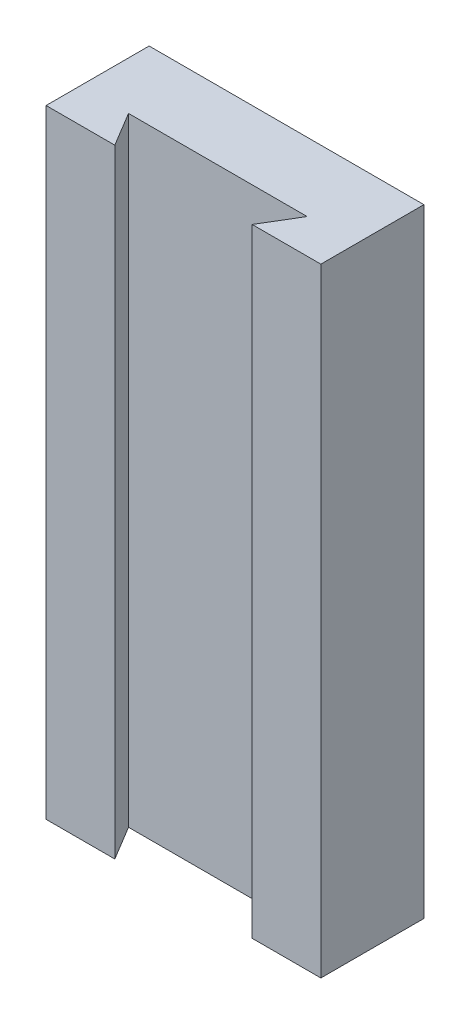
ISO-10303-21;
HEADER;
FILE_DESCRIPTION(('STEP AP214'),'2;1');
FILE_NAME('part.step','',(''),(''),'','','');
FILE_SCHEMA(('AUTOMOTIVE_DESIGN { 1 0 10303 214 1 1 1 1 }'));
ENDSEC;
DATA;
#1=APPLICATION_CONTEXT('core data for automotive mechanical design processes');
#2=APPLICATION_PROTOCOL_DEFINITION('international standard','automotive_design',2000,#1);
#3=PRODUCT_CONTEXT('',#1,'mechanical');
#4=PRODUCT('Part','Part','',(#3));
#5=PRODUCT_RELATED_PRODUCT_CATEGORY('part','',(#4));
#6=PRODUCT_DEFINITION_FORMATION('','',#4);
#7=PRODUCT_DEFINITION_CONTEXT('part definition',#1,'design');
#8=PRODUCT_DEFINITION('design','',#6,#7);
#9=PRODUCT_DEFINITION_SHAPE('','',#8);
#10=(LENGTH_UNIT() NAMED_UNIT(*) SI_UNIT(.MILLI.,.METRE.));
#11=(NAMED_UNIT(*) PLANE_ANGLE_UNIT() SI_UNIT($,.RADIAN.));
#12=(NAMED_UNIT(*) SI_UNIT($,.STERADIAN.) SOLID_ANGLE_UNIT());
#13=UNCERTAINTY_MEASURE_WITH_UNIT(LENGTH_MEASURE(1.E-05),#10,'distance_accuracy_value','');
#14=(GEOMETRIC_REPRESENTATION_CONTEXT(3) GLOBAL_UNCERTAINTY_ASSIGNED_CONTEXT((#13)) GLOBAL_UNIT_ASSIGNED_CONTEXT((#10,
#11,#12)) REPRESENTATION_CONTEXT('',''));
#15=CARTESIAN_POINT('',(0.,0.,0.));
#16=DIRECTION('',(0.,0.,1.));
#17=DIRECTION('',(1.,0.,0.));
#18=AXIS2_PLACEMENT_3D('',#15,#16,#17);
#19=CARTESIAN_POINT('',(0.,0.,15.));
#20=DIRECTION('',(0.,0.,1.));
#21=DIRECTION('',(1.,0.,0.));
#22=AXIS2_PLACEMENT_3D('',#19,#20,#21);
#23=PLANE('',#22);
#24=DIRECTION('',(0.,-1.,0.));
#25=VECTOR('',#24,1.);
#26=CARTESIAN_POINT('',(30.,0.,15.));
#27=LINE('',#26,#25);
#28=CARTESIAN_POINT('',(30.,0.,15.));
#29=VERTEX_POINT('',#28);
#30=CARTESIAN_POINT('',(30.,-90.,15.));
#31=VERTEX_POINT('',#30);
#32=EDGE_CURVE('E134',#29,#31,#27,.T.);
#33=ORIENTED_EDGE('',*,*,#32,.T.);
#34=DIRECTION('',(1.,0.,0.));
#35=VECTOR('',#34,1.);
#36=CARTESIAN_POINT('',(0.,-90.,15.));
#37=LINE('',#36,#35);
#38=CARTESIAN_POINT('',(40.,-90.,15.));
#39=VERTEX_POINT('',#38);
#40=EDGE_CURVE('E142',#31,#39,#37,.T.);
#41=ORIENTED_EDGE('',*,*,#40,.T.);
#42=DIRECTION('',(0.,1.,0.));
#43=VECTOR('',#42,1.);
#44=CARTESIAN_POINT('',(40.,0.,15.));
#45=LINE('',#44,#43);
#46=CARTESIAN_POINT('',(40.,0.,15.));
#47=VERTEX_POINT('',#46);
#48=EDGE_CURVE('E144',#39,#47,#45,.T.);
#49=ORIENTED_EDGE('',*,*,#48,.T.);
#50=DIRECTION('',(-1.,0.,0.));
#51=VECTOR('',#50,1.);
#52=CARTESIAN_POINT('',(0.,0.,15.));
#53=LINE('',#52,#51);
#54=EDGE_CURVE('E146',#47,#29,#53,.T.);
#55=ORIENTED_EDGE('',*,*,#54,.T.);
#56=EDGE_LOOP('',(#33,#41,#49,#55));
#57=FACE_BOUND('',#56,.T.);
#58=ADVANCED_FACE('F35',(#57),#23,.T.);
#59=CARTESIAN_POINT('',(0.,0.,15.));
#60=DIRECTION('',(1.,0.,0.));
#61=DIRECTION('',(0.,1.,0.));
#62=AXIS2_PLACEMENT_3D('',#59,#60,#61);
#63=PLANE('',#62);
#64=DIRECTION('',(0.,-1.,0.));
#65=VECTOR('',#64,1.);
#66=CARTESIAN_POINT('',(0.,0.,0.));
#67=LINE('',#66,#65);
#68=CARTESIAN_POINT('',(0.,0.,0.));
#69=VERTEX_POINT('',#68);
#70=CARTESIAN_POINT('',(0.,-90.,0.));
#71=VERTEX_POINT('',#70);
#72=EDGE_CURVE('E137',#69,#71,#67,.T.);
#73=ORIENTED_EDGE('',*,*,#72,.T.);
#74=DIRECTION('',(0.,0.,-1.));
#75=VECTOR('',#74,1.);
#76=CARTESIAN_POINT('',(0.,-90.,15.));
#77=LINE('',#76,#75);
#78=CARTESIAN_POINT('',(0.,-90.,15.));
#79=VERTEX_POINT('',#78);
#80=EDGE_CURVE('E11',#79,#71,#77,.T.);
#81=ORIENTED_EDGE('',*,*,#80,.F.);
#82=DIRECTION('',(0.,-1.,0.));
#83=VECTOR('',#82,1.);
#84=CARTESIAN_POINT('',(0.,0.,15.));
#85=LINE('',#84,#83);
#86=CARTESIAN_POINT('',(0.,0.,15.));
#87=VERTEX_POINT('',#86);
#88=EDGE_CURVE('E140',#87,#79,#85,.T.);
#89=ORIENTED_EDGE('',*,*,#88,.F.);
#90=DIRECTION('',(0.,0.,-1.));
#91=VECTOR('',#90,1.);
#92=CARTESIAN_POINT('',(0.,0.,15.));
#93=LINE('',#92,#91);
#94=EDGE_CURVE('E149',#87,#69,#93,.T.);
#95=ORIENTED_EDGE('',*,*,#94,.T.);
#96=EDGE_LOOP('',(#73,#81,#89,#95));
#97=FACE_BOUND('',#96,.T.);
#98=ADVANCED_FACE('F37',(#97),#63,.F.);
#99=CARTESIAN_POINT('',(0.,-90.,15.));
#100=DIRECTION('',(0.,1.,0.));
#101=DIRECTION('',(0.,0.,1.));
#102=AXIS2_PLACEMENT_3D('',#99,#100,#101);
#103=PLANE('',#102);
#104=ORIENTED_EDGE('',*,*,#40,.F.);
#105=DIRECTION('',(-0.514495755427527,0.,0.857492925712544));
#106=VECTOR('',#105,1.);
#107=CARTESIAN_POINT('',(33.,-90.,10.));
#108=LINE('',#107,#106);
#109=CARTESIAN_POINT('',(33.,-90.,10.));
#110=VERTEX_POINT('',#109);
#111=EDGE_CURVE('E126',#110,#31,#108,.T.);
#112=ORIENTED_EDGE('',*,*,#111,.F.);
#113=DIRECTION('',(1.,0.,0.));
#114=VECTOR('',#113,1.);
#115=CARTESIAN_POINT('',(7.00000000000001,-90.,10.));
#116=LINE('',#115,#114);
#117=CARTESIAN_POINT('',(7.00000000000001,-90.,10.));
#118=VERTEX_POINT('',#117);
#119=EDGE_CURVE('E128',#118,#110,#116,.T.);
#120=ORIENTED_EDGE('',*,*,#119,.F.);
#121=DIRECTION('',(-0.514495755427526,0.,-0.857492925712544));
#122=VECTOR('',#121,1.);
#123=CARTESIAN_POINT('',(10.,-90.,15.));
#124=LINE('',#123,#122);
#125=CARTESIAN_POINT('',(10.,-90.,15.));
#126=VERTEX_POINT('',#125);
#127=EDGE_CURVE('E111',#126,#118,#124,.T.);
#128=ORIENTED_EDGE('',*,*,#127,.F.);
#129=EDGE_CURVE('E87',#79,#126,#37,.T.);
#130=ORIENTED_EDGE('',*,*,#129,.F.);
#131=ORIENTED_EDGE('',*,*,#80,.T.);
#132=DIRECTION('',(1.,0.,0.));
#133=VECTOR('',#132,1.);
#134=CARTESIAN_POINT('',(0.,-90.,0.));
#135=LINE('',#134,#133);
#136=CARTESIAN_POINT('',(40.,-90.,0.));
#137=VERTEX_POINT('',#136);
#138=EDGE_CURVE('E152',#71,#137,#135,.T.);
#139=ORIENTED_EDGE('',*,*,#138,.T.);
#140=DIRECTION('',(0.,0.,-1.));
#141=VECTOR('',#140,1.);
#142=CARTESIAN_POINT('',(40.,-90.,15.));
#143=LINE('',#142,#141);
#144=EDGE_CURVE('E43',#39,#137,#143,.T.);
#145=ORIENTED_EDGE('',*,*,#144,.F.);
#146=EDGE_LOOP('',(#104,#112,#120,#128,#130,#131,#139,#145));
#147=FACE_BOUND('',#146,.T.);
#148=ADVANCED_FACE('F174',(#147),#103,.F.);
#149=CARTESIAN_POINT('',(40.,0.,15.));
#150=DIRECTION('',(-1.,0.,0.));
#151=DIRECTION('',(0.,-1.,0.));
#152=AXIS2_PLACEMENT_3D('',#149,#150,#151);
#153=PLANE('',#152);
#154=DIRECTION('',(0.,1.,0.));
#155=VECTOR('',#154,1.);
#156=CARTESIAN_POINT('',(40.,0.,0.));
#157=LINE('',#156,#155);
#158=CARTESIAN_POINT('',(40.,0.,0.));
#159=VERTEX_POINT('',#158);
#160=EDGE_CURVE('E154',#137,#159,#157,.T.);
#161=ORIENTED_EDGE('',*,*,#160,.T.);
#162=DIRECTION('',(0.,0.,-1.));
#163=VECTOR('',#162,1.);
#164=CARTESIAN_POINT('',(40.,0.,15.));
#165=LINE('',#164,#163);
#166=EDGE_CURVE('E158',#47,#159,#165,.T.);
#167=ORIENTED_EDGE('',*,*,#166,.F.);
#168=ORIENTED_EDGE('',*,*,#48,.F.);
#169=ORIENTED_EDGE('',*,*,#144,.T.);
#170=EDGE_LOOP('',(#161,#167,#168,#169));
#171=FACE_BOUND('',#170,.T.);
#172=ADVANCED_FACE('F164',(#171),#153,.F.);
#173=CARTESIAN_POINT('',(0.,0.,15.));
#174=DIRECTION('',(0.,-1.,0.));
#175=DIRECTION('',(0.,0.,-1.));
#176=AXIS2_PLACEMENT_3D('',#173,#174,#175);
#177=PLANE('',#176);
#178=DIRECTION('',(1.,0.,0.));
#179=VECTOR('',#178,1.);
#180=CARTESIAN_POINT('',(7.00000000000001,0.,10.));
#181=LINE('',#180,#179);
#182=CARTESIAN_POINT('',(7.00000000000001,0.,10.));
#183=VERTEX_POINT('',#182);
#184=CARTESIAN_POINT('',(33.,0.,10.));
#185=VERTEX_POINT('',#184);
#186=EDGE_CURVE('E119',#183,#185,#181,.T.);
#187=ORIENTED_EDGE('',*,*,#186,.T.);
#188=DIRECTION('',(-0.514495755427527,0.,0.857492925712544));
#189=VECTOR('',#188,1.);
#190=CARTESIAN_POINT('',(33.,0.,10.));
#191=LINE('',#190,#189);
#192=EDGE_CURVE('E123',#185,#29,#191,.T.);
#193=ORIENTED_EDGE('',*,*,#192,.T.);
#194=ORIENTED_EDGE('',*,*,#54,.F.);
#195=ORIENTED_EDGE('',*,*,#166,.T.);
#196=DIRECTION('',(-1.,0.,0.));
#197=VECTOR('',#196,1.);
#198=CARTESIAN_POINT('',(0.,0.,0.));
#199=LINE('',#198,#197);
#200=EDGE_CURVE('E80',#159,#69,#199,.T.);
#201=ORIENTED_EDGE('',*,*,#200,.T.);
#202=ORIENTED_EDGE('',*,*,#94,.F.);
#203=CARTESIAN_POINT('',(10.,0.,15.));
#204=VERTEX_POINT('',#203);
#205=EDGE_CURVE('E58',#204,#87,#53,.T.);
#206=ORIENTED_EDGE('',*,*,#205,.F.);
#207=DIRECTION('',(-0.514495755427526,0.,-0.857492925712544));
#208=VECTOR('',#207,1.);
#209=CARTESIAN_POINT('',(10.,0.,15.));
#210=LINE('',#209,#208);
#211=EDGE_CURVE('E50',#204,#183,#210,.T.);
#212=ORIENTED_EDGE('',*,*,#211,.T.);
#213=EDGE_LOOP('',(#187,#193,#194,#195,#201,#202,#206,#212));
#214=FACE_BOUND('',#213,.T.);
#215=ADVANCED_FACE('F125',(#214),#177,.F.);
#216=DIRECTION('',(0.,-1.,0.));
#217=VECTOR('',#216,1.);
#218=CARTESIAN_POINT('',(10.,0.,15.));
#219=LINE('',#218,#217);
#220=EDGE_CURVE('E116',#204,#126,#219,.T.);
#221=ORIENTED_EDGE('',*,*,#220,.F.);
#222=ORIENTED_EDGE('',*,*,#205,.T.);
#223=ORIENTED_EDGE('',*,*,#88,.T.);
#224=ORIENTED_EDGE('',*,*,#129,.T.);
#225=EDGE_LOOP('',(#221,#222,#223,#224));
#226=FACE_BOUND('',#225,.T.);
#227=ADVANCED_FACE('F173',(#226),#23,.T.);
#228=CARTESIAN_POINT('',(0.,0.,0.));
#229=DIRECTION('',(0.,0.,1.));
#230=DIRECTION('',(1.,0.,0.));
#231=AXIS2_PLACEMENT_3D('',#228,#229,#230);
#232=PLANE('',#231);
#233=ORIENTED_EDGE('',*,*,#72,.F.);
#234=ORIENTED_EDGE('',*,*,#200,.F.);
#235=ORIENTED_EDGE('',*,*,#160,.F.);
#236=ORIENTED_EDGE('',*,*,#138,.F.);
#237=EDGE_LOOP('',(#233,#234,#235,#236));
#238=FACE_BOUND('',#237,.T.);
#239=ADVANCED_FACE('F169',(#238),#232,.F.);
#240=CARTESIAN_POINT('',(33.,0.,10.));
#241=DIRECTION('',(0.857492925712544,0.,0.514495755427527));
#242=DIRECTION('',(0.514495755427527,0.,-0.857492925712544));
#243=AXIS2_PLACEMENT_3D('',#240,#241,#242);
#244=PLANE('',#243);
#245=ORIENTED_EDGE('',*,*,#111,.T.);
#246=ORIENTED_EDGE('',*,*,#32,.F.);
#247=ORIENTED_EDGE('',*,*,#192,.F.);
#248=DIRECTION('',(0.,-1.,0.));
#249=VECTOR('',#248,1.);
#250=CARTESIAN_POINT('',(33.,0.,10.));
#251=LINE('',#250,#249);
#252=EDGE_CURVE('E115',#185,#110,#251,.T.);
#253=ORIENTED_EDGE('',*,*,#252,.T.);
#254=EDGE_LOOP('',(#245,#246,#247,#253));
#255=FACE_BOUND('',#254,.T.);
#256=ADVANCED_FACE('F177',(#255),#244,.F.);
#257=CARTESIAN_POINT('',(7.00000000000001,0.,10.));
#258=DIRECTION('',(0.,0.,-1.));
#259=DIRECTION('',(-1.,0.,0.));
#260=AXIS2_PLACEMENT_3D('',#257,#258,#259);
#261=PLANE('',#260);
#262=ORIENTED_EDGE('',*,*,#119,.T.);
#263=ORIENTED_EDGE('',*,*,#252,.F.);
#264=ORIENTED_EDGE('',*,*,#186,.F.);
#265=DIRECTION('',(0.,-1.,0.));
#266=VECTOR('',#265,1.);
#267=CARTESIAN_POINT('',(7.00000000000001,0.,10.));
#268=LINE('',#267,#266);
#269=EDGE_CURVE('E108',#183,#118,#268,.T.);
#270=ORIENTED_EDGE('',*,*,#269,.T.);
#271=EDGE_LOOP('',(#262,#263,#264,#270));
#272=FACE_BOUND('',#271,.T.);
#273=ADVANCED_FACE('F120',(#272),#261,.F.);
#274=CARTESIAN_POINT('',(10.,0.,15.));
#275=DIRECTION('',(-0.857492925712544,0.,0.514495755427526));
#276=DIRECTION('',(0.514495755427526,0.,0.857492925712544));
#277=AXIS2_PLACEMENT_3D('',#274,#275,#276);
#278=PLANE('',#277);
#279=ORIENTED_EDGE('',*,*,#127,.T.);
#280=ORIENTED_EDGE('',*,*,#269,.F.);
#281=ORIENTED_EDGE('',*,*,#211,.F.);
#282=ORIENTED_EDGE('',*,*,#220,.T.);
#283=EDGE_LOOP('',(#279,#280,#281,#282));
#284=FACE_BOUND('',#283,.T.);
#285=ADVANCED_FACE('F110',(#284),#278,.F.);
#286=CLOSED_SHELL('',(#58,#98,#148,#172,#215,#227,#239,#256,#273,#285));
#287=MANIFOLD_SOLID_BREP('B2',#286);
#288=ADVANCED_BREP_SHAPE_REPRESENTATION('',(#18,#287),#14);
#289=SHAPE_DEFINITION_REPRESENTATION(#9,#288);
ENDSEC;
END-ISO-10303-21;
